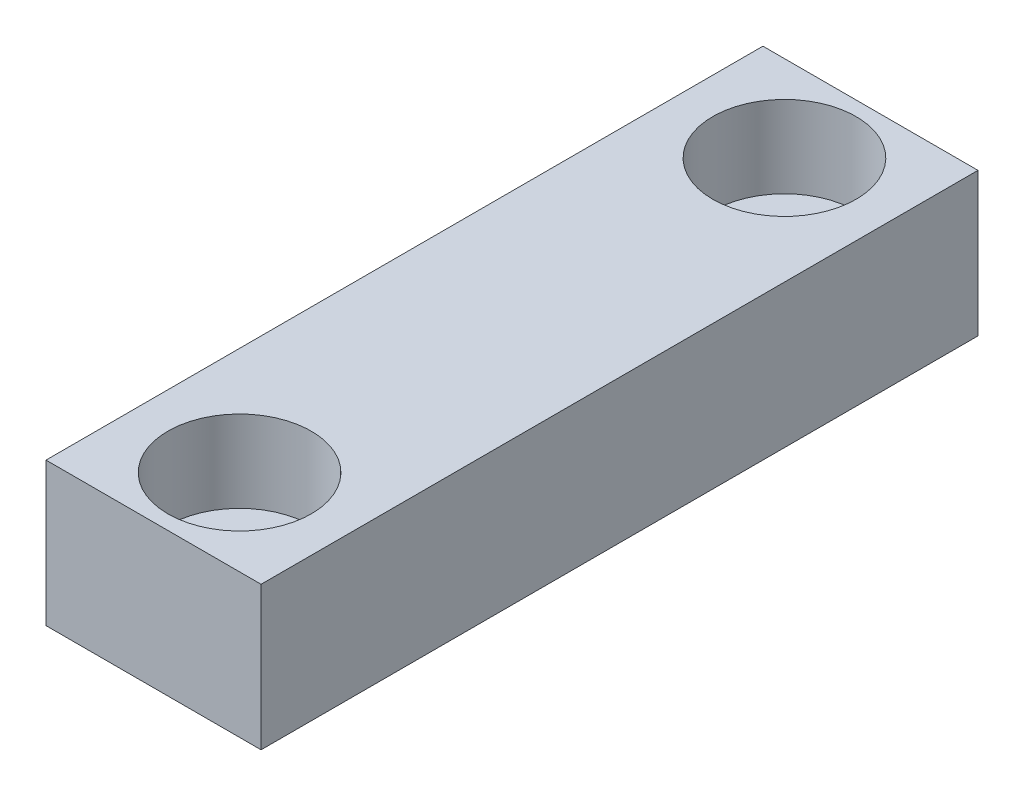
ISO-10303-21;
HEADER;
FILE_DESCRIPTION(('STEP AP214'),'2;1');
FILE_NAME('part.step','',(''),(''),'','','');
FILE_SCHEMA(('AUTOMOTIVE_DESIGN { 1 0 10303 214 1 1 1 1 }'));
ENDSEC;
DATA;
#1=APPLICATION_CONTEXT('core data for automotive mechanical design processes');
#2=APPLICATION_PROTOCOL_DEFINITION('international standard','automotive_design',2000,#1);
#3=PRODUCT_CONTEXT('',#1,'mechanical');
#4=PRODUCT('Part','Part','',(#3));
#5=PRODUCT_RELATED_PRODUCT_CATEGORY('part','',(#4));
#6=PRODUCT_DEFINITION_FORMATION('','',#4);
#7=PRODUCT_DEFINITION_CONTEXT('part definition',#1,'design');
#8=PRODUCT_DEFINITION('design','',#6,#7);
#9=PRODUCT_DEFINITION_SHAPE('','',#8);
#10=(LENGTH_UNIT() NAMED_UNIT(*) SI_UNIT(.MILLI.,.METRE.));
#11=(NAMED_UNIT(*) PLANE_ANGLE_UNIT() SI_UNIT($,.RADIAN.));
#12=(NAMED_UNIT(*) SI_UNIT($,.STERADIAN.) SOLID_ANGLE_UNIT());
#13=UNCERTAINTY_MEASURE_WITH_UNIT(LENGTH_MEASURE(1.E-05),#10,'distance_accuracy_value','');
#14=(GEOMETRIC_REPRESENTATION_CONTEXT(3) GLOBAL_UNCERTAINTY_ASSIGNED_CONTEXT((#13)) GLOBAL_UNIT_ASSIGNED_CONTEXT((#10,
#11,#12)) REPRESENTATION_CONTEXT('',''));
#15=CARTESIAN_POINT('',(0.,0.,0.));
#16=DIRECTION('',(0.,0.,1.));
#17=DIRECTION('',(1.,0.,0.));
#18=AXIS2_PLACEMENT_3D('',#15,#16,#17);
#19=CARTESIAN_POINT('',(-7.5,10.,25.));
#20=DIRECTION('',(1.,0.,0.));
#21=DIRECTION('',(0.,0.,-1.));
#22=AXIS2_PLACEMENT_3D('',#19,#20,#21);
#23=PLANE('',#22);
#24=DIRECTION('',(0.,0.,1.));
#25=VECTOR('',#24,1.);
#26=CARTESIAN_POINT('',(-7.5,0.,25.));
#27=LINE('',#26,#25);
#28=CARTESIAN_POINT('',(-7.5,0.,-25.));
#29=VERTEX_POINT('',#28);
#30=CARTESIAN_POINT('',(-7.5,0.,25.));
#31=VERTEX_POINT('',#30);
#32=EDGE_CURVE('E83',#29,#31,#27,.T.);
#33=ORIENTED_EDGE('',*,*,#32,.T.);
#34=DIRECTION('',(0.,-1.,0.));
#35=VECTOR('',#34,1.);
#36=CARTESIAN_POINT('',(-7.5,10.,25.));
#37=LINE('',#36,#35);
#38=CARTESIAN_POINT('',(-7.5,10.,25.));
#39=VERTEX_POINT('',#38);
#40=EDGE_CURVE('E11',#39,#31,#37,.T.);
#41=ORIENTED_EDGE('',*,*,#40,.F.);
#42=DIRECTION('',(0.,0.,1.));
#43=VECTOR('',#42,1.);
#44=CARTESIAN_POINT('',(-7.5,10.,25.));
#45=LINE('',#44,#43);
#46=CARTESIAN_POINT('',(-7.5,10.,-25.));
#47=VERTEX_POINT('',#46);
#48=EDGE_CURVE('E70',#47,#39,#45,.T.);
#49=ORIENTED_EDGE('',*,*,#48,.F.);
#50=DIRECTION('',(0.,-1.,0.));
#51=VECTOR('',#50,1.);
#52=CARTESIAN_POINT('',(-7.5,10.,-25.));
#53=LINE('',#52,#51);
#54=EDGE_CURVE('E79',#47,#29,#53,.T.);
#55=ORIENTED_EDGE('',*,*,#54,.T.);
#56=EDGE_LOOP('',(#33,#41,#49,#55));
#57=FACE_BOUND('',#56,.T.);
#58=ADVANCED_FACE('F17',(#57),#23,.F.);
#59=CARTESIAN_POINT('',(7.5,10.,25.));
#60=DIRECTION('',(0.,0.,-1.));
#61=DIRECTION('',(-1.,0.,0.));
#62=AXIS2_PLACEMENT_3D('',#59,#60,#61);
#63=PLANE('',#62);
#64=DIRECTION('',(1.,0.,0.));
#65=VECTOR('',#64,1.);
#66=CARTESIAN_POINT('',(7.5,0.,25.));
#67=LINE('',#66,#65);
#68=CARTESIAN_POINT('',(7.5,0.,25.));
#69=VERTEX_POINT('',#68);
#70=EDGE_CURVE('E74',#31,#69,#67,.T.);
#71=ORIENTED_EDGE('',*,*,#70,.T.);
#72=DIRECTION('',(0.,-1.,0.));
#73=VECTOR('',#72,1.);
#74=CARTESIAN_POINT('',(7.5,10.,25.));
#75=LINE('',#74,#73);
#76=CARTESIAN_POINT('',(7.5,10.,25.));
#77=VERTEX_POINT('',#76);
#78=EDGE_CURVE('E26',#77,#69,#75,.T.);
#79=ORIENTED_EDGE('',*,*,#78,.F.);
#80=DIRECTION('',(1.,0.,0.));
#81=VECTOR('',#80,1.);
#82=CARTESIAN_POINT('',(7.5,10.,25.));
#83=LINE('',#82,#81);
#84=EDGE_CURVE('E65',#39,#77,#83,.T.);
#85=ORIENTED_EDGE('',*,*,#84,.F.);
#86=ORIENTED_EDGE('',*,*,#40,.T.);
#87=EDGE_LOOP('',(#71,#79,#85,#86));
#88=FACE_BOUND('',#87,.T.);
#89=ADVANCED_FACE('F73',(#88),#63,.F.);
#90=CARTESIAN_POINT('',(7.5,10.,25.));
#91=DIRECTION('',(-1.,0.,0.));
#92=DIRECTION('',(0.,0.,1.));
#93=AXIS2_PLACEMENT_3D('',#90,#91,#92);
#94=PLANE('',#93);
#95=DIRECTION('',(0.,0.,-1.));
#96=VECTOR('',#95,1.);
#97=CARTESIAN_POINT('',(7.5,0.,25.));
#98=LINE('',#97,#96);
#99=CARTESIAN_POINT('',(7.5,0.,-25.));
#100=VERTEX_POINT('',#99);
#101=EDGE_CURVE('E52',#69,#100,#98,.T.);
#102=ORIENTED_EDGE('',*,*,#101,.T.);
#103=DIRECTION('',(0.,-1.,0.));
#104=VECTOR('',#103,1.);
#105=CARTESIAN_POINT('',(7.5,10.,-25.));
#106=LINE('',#105,#104);
#107=CARTESIAN_POINT('',(7.5,10.,-25.));
#108=VERTEX_POINT('',#107);
#109=EDGE_CURVE('E75',#108,#100,#106,.T.);
#110=ORIENTED_EDGE('',*,*,#109,.F.);
#111=DIRECTION('',(0.,0.,-1.));
#112=VECTOR('',#111,1.);
#113=CARTESIAN_POINT('',(7.5,10.,25.));
#114=LINE('',#113,#112);
#115=EDGE_CURVE('E68',#77,#108,#114,.T.);
#116=ORIENTED_EDGE('',*,*,#115,.F.);
#117=ORIENTED_EDGE('',*,*,#78,.T.);
#118=EDGE_LOOP('',(#102,#110,#116,#117));
#119=FACE_BOUND('',#118,.T.);
#120=ADVANCED_FACE('F77',(#119),#94,.F.);
#121=CARTESIAN_POINT('',(7.5,10.,-25.));
#122=DIRECTION('',(0.,0.,1.));
#123=DIRECTION('',(1.,0.,0.));
#124=AXIS2_PLACEMENT_3D('',#121,#122,#123);
#125=PLANE('',#124);
#126=DIRECTION('',(-1.,0.,0.));
#127=VECTOR('',#126,1.);
#128=CARTESIAN_POINT('',(7.5,0.,-25.));
#129=LINE('',#128,#127);
#130=EDGE_CURVE('E58',#100,#29,#129,.T.);
#131=ORIENTED_EDGE('',*,*,#130,.T.);
#132=ORIENTED_EDGE('',*,*,#54,.F.);
#133=DIRECTION('',(-1.,0.,0.));
#134=VECTOR('',#133,1.);
#135=CARTESIAN_POINT('',(7.5,10.,-25.));
#136=LINE('',#135,#134);
#137=EDGE_CURVE('E35',#108,#47,#136,.T.);
#138=ORIENTED_EDGE('',*,*,#137,.F.);
#139=ORIENTED_EDGE('',*,*,#109,.T.);
#140=EDGE_LOOP('',(#131,#132,#138,#139));
#141=FACE_BOUND('',#140,.T.);
#142=ADVANCED_FACE('F121',(#141),#125,.F.);
#143=CARTESIAN_POINT('',(0.,10.,0.));
#144=DIRECTION('',(0.,1.,0.));
#145=DIRECTION('',(0.,0.,1.));
#146=AXIS2_PLACEMENT_3D('',#143,#144,#145);
#147=PLANE('',#146);
#148=CARTESIAN_POINT('',(0.,10.,-19.));
#149=DIRECTION('',(0.,1.,0.));
#150=DIRECTION('',(0.,0.,1.));
#151=AXIS2_PLACEMENT_3D('',#148,#149,#150);
#152=CIRCLE('',#151,5.);
#153=CARTESIAN_POINT('',(0.,10.,-14.));
#154=VERTEX_POINT('',#153);
#155=EDGE_CURVE('E112',#154,#154,#152,.T.);
#156=ORIENTED_EDGE('',*,*,#155,.F.);
#157=EDGE_LOOP('',(#156));
#158=FACE_BOUND('',#157,.T.);
#159=CARTESIAN_POINT('',(0.,10.,19.));
#160=DIRECTION('',(0.,1.,0.));
#161=DIRECTION('',(0.,0.,1.));
#162=AXIS2_PLACEMENT_3D('',#159,#160,#161);
#163=CIRCLE('',#162,5.);
#164=CARTESIAN_POINT('',(0.,10.,24.));
#165=VERTEX_POINT('',#164);
#166=EDGE_CURVE('E101',#165,#165,#163,.T.);
#167=ORIENTED_EDGE('',*,*,#166,.F.);
#168=EDGE_LOOP('',(#167));
#169=FACE_BOUND('',#168,.T.);
#170=ORIENTED_EDGE('',*,*,#48,.T.);
#171=ORIENTED_EDGE('',*,*,#84,.T.);
#172=ORIENTED_EDGE('',*,*,#115,.T.);
#173=ORIENTED_EDGE('',*,*,#137,.T.);
#174=EDGE_LOOP('',(#170,#171,#172,#173));
#175=FACE_BOUND('',#174,.T.);
#176=ADVANCED_FACE('F66',(#158,#169,#175),#147,.T.);
#177=CARTESIAN_POINT('',(0.,0.,0.));
#178=DIRECTION('',(0.,1.,0.));
#179=DIRECTION('',(0.,0.,1.));
#180=AXIS2_PLACEMENT_3D('',#177,#178,#179);
#181=PLANE('',#180);
#182=CARTESIAN_POINT('',(0.,0.,-19.));
#183=DIRECTION('',(0.,1.,0.));
#184=DIRECTION('',(0.,0.,1.));
#185=AXIS2_PLACEMENT_3D('',#182,#183,#184);
#186=CIRCLE('',#185,2.75);
#187=CARTESIAN_POINT('',(0.,0.,-16.25));
#188=VERTEX_POINT('',#187);
#189=EDGE_CURVE('E20',#188,#188,#186,.T.);
#190=ORIENTED_EDGE('',*,*,#189,.T.);
#191=EDGE_LOOP('',(#190));
#192=FACE_BOUND('',#191,.T.);
#193=CARTESIAN_POINT('',(0.,0.,19.));
#194=DIRECTION('',(0.,1.,0.));
#195=DIRECTION('',(0.,0.,1.));
#196=AXIS2_PLACEMENT_3D('',#193,#194,#195);
#197=CIRCLE('',#196,2.75);
#198=CARTESIAN_POINT('',(0.,0.,21.75));
#199=VERTEX_POINT('',#198);
#200=EDGE_CURVE('E86',#199,#199,#197,.T.);
#201=ORIENTED_EDGE('',*,*,#200,.T.);
#202=EDGE_LOOP('',(#201));
#203=FACE_BOUND('',#202,.T.);
#204=ORIENTED_EDGE('',*,*,#32,.F.);
#205=ORIENTED_EDGE('',*,*,#130,.F.);
#206=ORIENTED_EDGE('',*,*,#101,.F.);
#207=ORIENTED_EDGE('',*,*,#70,.F.);
#208=EDGE_LOOP('',(#204,#205,#206,#207));
#209=FACE_BOUND('',#208,.T.);
#210=ADVANCED_FACE('F120',(#192,#203,#209),#181,.F.);
#211=CARTESIAN_POINT('',(0.,10.,19.));
#212=DIRECTION('',(0.,1.,0.));
#213=DIRECTION('',(0.,0.,1.));
#214=AXIS2_PLACEMENT_3D('',#211,#212,#213);
#215=CYLINDRICAL_SURFACE('',#214,2.75);
#216=CARTESIAN_POINT('',(0.,4.3,19.));
#217=DIRECTION('',(0.,1.,0.));
#218=DIRECTION('',(0.,0.,1.));
#219=AXIS2_PLACEMENT_3D('',#216,#217,#218);
#220=CIRCLE('',#219,2.75);
#221=CARTESIAN_POINT('',(0.,4.3,21.75));
#222=VERTEX_POINT('',#221);
#223=EDGE_CURVE('E92',#222,#222,#220,.T.);
#224=ORIENTED_EDGE('',*,*,#223,.T.);
#225=EDGE_LOOP('',(#224));
#226=FACE_BOUND('',#225,.T.);
#227=ORIENTED_EDGE('',*,*,#200,.F.);
#228=EDGE_LOOP('',(#227));
#229=FACE_BOUND('',#228,.T.);
#230=ADVANCED_FACE('F140',(#226,#229),#215,.F.);
#231=CARTESIAN_POINT('',(2.75,4.3,19.));
#232=DIRECTION('',(0.,-1.,0.));
#233=DIRECTION('',(0.,0.,-1.));
#234=AXIS2_PLACEMENT_3D('',#231,#232,#233);
#235=PLANE('',#234);
#236=ORIENTED_EDGE('',*,*,#223,.F.);
#237=EDGE_LOOP('',(#236));
#238=FACE_BOUND('',#237,.T.);
#239=CARTESIAN_POINT('',(0.,4.3,19.));
#240=DIRECTION('',(0.,1.,0.));
#241=DIRECTION('',(0.,0.,1.));
#242=AXIS2_PLACEMENT_3D('',#239,#240,#241);
#243=CIRCLE('',#242,5.);
#244=CARTESIAN_POINT('',(0.,4.3,24.));
#245=VERTEX_POINT('',#244);
#246=EDGE_CURVE('E96',#245,#245,#243,.T.);
#247=ORIENTED_EDGE('',*,*,#246,.T.);
#248=EDGE_LOOP('',(#247));
#249=FACE_BOUND('',#248,.T.);
#250=ADVANCED_FACE('F128',(#238,#249),#235,.F.);
#251=CARTESIAN_POINT('',(0.,10.,19.));
#252=DIRECTION('',(0.,1.,0.));
#253=DIRECTION('',(0.,0.,1.));
#254=AXIS2_PLACEMENT_3D('',#251,#252,#253);
#255=CYLINDRICAL_SURFACE('',#254,5.);
#256=ORIENTED_EDGE('',*,*,#246,.F.);
#257=EDGE_LOOP('',(#256));
#258=FACE_BOUND('',#257,.T.);
#259=ORIENTED_EDGE('',*,*,#166,.T.);
#260=EDGE_LOOP('',(#259));
#261=FACE_BOUND('',#260,.T.);
#262=ADVANCED_FACE('F125',(#258,#261),#255,.F.);
#263=CARTESIAN_POINT('',(0.,10.,-19.));
#264=DIRECTION('',(0.,1.,0.));
#265=DIRECTION('',(0.,0.,1.));
#266=AXIS2_PLACEMENT_3D('',#263,#264,#265);
#267=CYLINDRICAL_SURFACE('',#266,2.75);
#268=CARTESIAN_POINT('',(0.,4.3,-19.));
#269=DIRECTION('',(0.,1.,0.));
#270=DIRECTION('',(0.,0.,1.));
#271=AXIS2_PLACEMENT_3D('',#268,#269,#270);
#272=CIRCLE('',#271,2.75);
#273=CARTESIAN_POINT('',(0.,4.3,-16.25));
#274=VERTEX_POINT('',#273);
#275=EDGE_CURVE('E106',#274,#274,#272,.T.);
#276=ORIENTED_EDGE('',*,*,#275,.T.);
#277=EDGE_LOOP('',(#276));
#278=FACE_BOUND('',#277,.T.);
#279=ORIENTED_EDGE('',*,*,#189,.F.);
#280=EDGE_LOOP('',(#279));
#281=FACE_BOUND('',#280,.T.);
#282=ADVANCED_FACE('F127',(#278,#281),#267,.F.);
#283=CARTESIAN_POINT('',(2.75,4.3,-19.));
#284=DIRECTION('',(0.,-1.,0.));
#285=DIRECTION('',(0.,0.,-1.));
#286=AXIS2_PLACEMENT_3D('',#283,#284,#285);
#287=PLANE('',#286);
#288=ORIENTED_EDGE('',*,*,#275,.F.);
#289=EDGE_LOOP('',(#288));
#290=FACE_BOUND('',#289,.T.);
#291=CARTESIAN_POINT('',(0.,4.3,-19.));
#292=DIRECTION('',(0.,1.,0.));
#293=DIRECTION('',(0.,0.,1.));
#294=AXIS2_PLACEMENT_3D('',#291,#292,#293);
#295=CIRCLE('',#294,5.);
#296=CARTESIAN_POINT('',(0.,4.3,-14.));
#297=VERTEX_POINT('',#296);
#298=EDGE_CURVE('E109',#297,#297,#295,.T.);
#299=ORIENTED_EDGE('',*,*,#298,.T.);
#300=EDGE_LOOP('',(#299));
#301=FACE_BOUND('',#300,.T.);
#302=ADVANCED_FACE('F137',(#290,#301),#287,.F.);
#303=CARTESIAN_POINT('',(0.,10.,-19.));
#304=DIRECTION('',(0.,1.,0.));
#305=DIRECTION('',(0.,0.,1.));
#306=AXIS2_PLACEMENT_3D('',#303,#304,#305);
#307=CYLINDRICAL_SURFACE('',#306,5.);
#308=ORIENTED_EDGE('',*,*,#298,.F.);
#309=EDGE_LOOP('',(#308));
#310=FACE_BOUND('',#309,.T.);
#311=ORIENTED_EDGE('',*,*,#155,.T.);
#312=EDGE_LOOP('',(#311));
#313=FACE_BOUND('',#312,.T.);
#314=ADVANCED_FACE('F116',(#310,#313),#307,.F.);
#315=CLOSED_SHELL('',(#58,#89,#120,#142,#176,#210,#230,#250,#262,#282,#302,#314));
#316=MANIFOLD_SOLID_BREP('B1',#315);
#317=ADVANCED_BREP_SHAPE_REPRESENTATION('',(#18,#316),#14);
#318=SHAPE_DEFINITION_REPRESENTATION(#9,#317);
ENDSEC;
END-ISO-10303-21;
